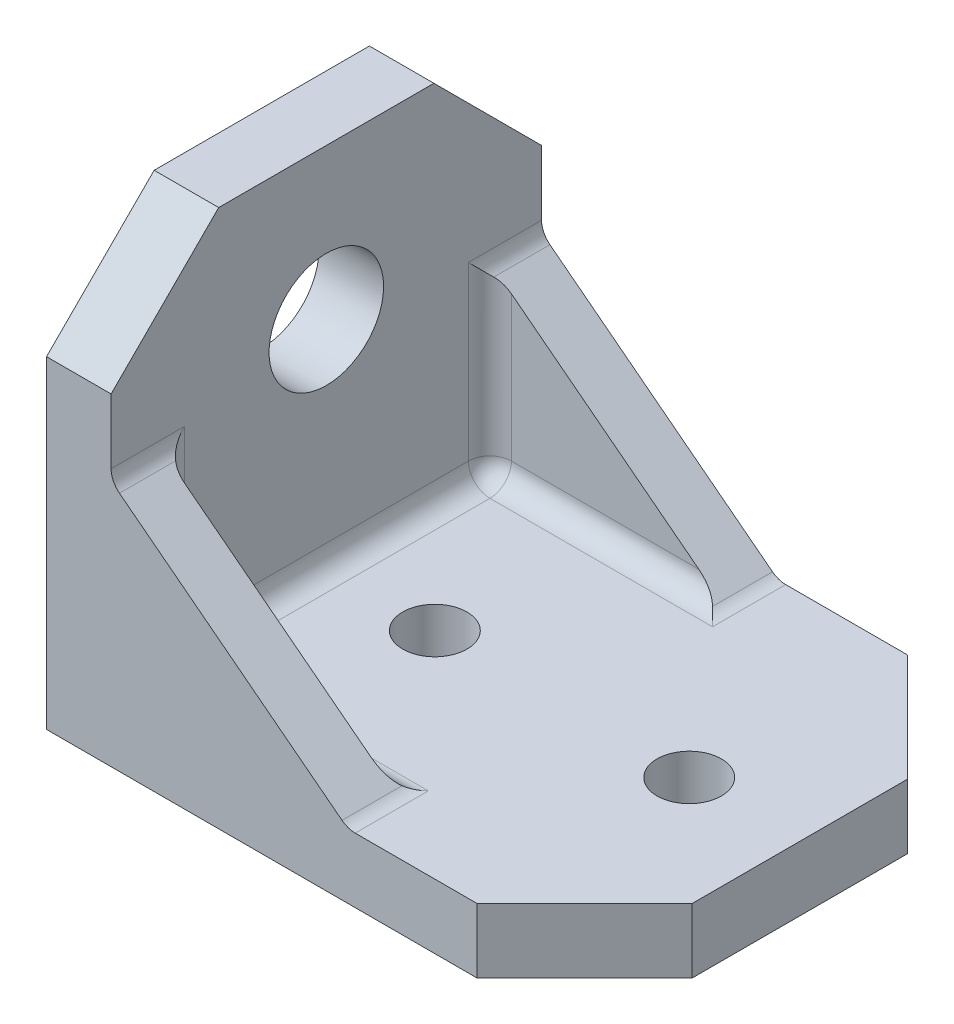
ISO-10303-21;
HEADER;
FILE_DESCRIPTION(('STEP AP214'),'2;1');
FILE_NAME('part.step','',(''),(''),'','','');
FILE_SCHEMA(('AUTOMOTIVE_DESIGN { 1 0 10303 214 1 1 1 1 }'));
ENDSEC;
DATA;
#1=APPLICATION_CONTEXT('core data for automotive mechanical design processes');
#2=APPLICATION_PROTOCOL_DEFINITION('international standard','automotive_design',2000,#1);
#3=PRODUCT_CONTEXT('',#1,'mechanical');
#4=PRODUCT('Part','Part','',(#3));
#5=PRODUCT_RELATED_PRODUCT_CATEGORY('part','',(#4));
#6=PRODUCT_DEFINITION_FORMATION('','',#4);
#7=PRODUCT_DEFINITION_CONTEXT('part definition',#1,'design');
#8=PRODUCT_DEFINITION('design','',#6,#7);
#9=PRODUCT_DEFINITION_SHAPE('','',#8);
#10=(LENGTH_UNIT() NAMED_UNIT(*) SI_UNIT(.MILLI.,.METRE.));
#11=(NAMED_UNIT(*) PLANE_ANGLE_UNIT() SI_UNIT($,.RADIAN.));
#12=(NAMED_UNIT(*) SI_UNIT($,.STERADIAN.) SOLID_ANGLE_UNIT());
#13=UNCERTAINTY_MEASURE_WITH_UNIT(LENGTH_MEASURE(1.E-05),#10,'distance_accuracy_value','');
#14=(GEOMETRIC_REPRESENTATION_CONTEXT(3) GLOBAL_UNCERTAINTY_ASSIGNED_CONTEXT((#13)) GLOBAL_UNIT_ASSIGNED_CONTEXT((#10,
#11,#12)) REPRESENTATION_CONTEXT('',''));
#15=CARTESIAN_POINT('',(0.,0.,0.));
#16=DIRECTION('',(0.,0.,1.));
#17=DIRECTION('',(1.,0.,0.));
#18=AXIS2_PLACEMENT_3D('',#15,#16,#17);
#19=CARTESIAN_POINT('',(0.,0.,25.4));
#20=DIRECTION('',(0.,1.,0.));
#21=DIRECTION('',(0.,0.,1.));
#22=AXIS2_PLACEMENT_3D('',#19,#20,#21);
#23=PLANE('',#22);
#24=CARTESIAN_POINT('',(10.2108,0.,12.7));
#25=DIRECTION('',(0.,1.,0.));
#26=DIRECTION('',(0.,0.,1.));
#27=AXIS2_PLACEMENT_3D('',#24,#25,#26);
#28=CIRCLE('',#27,1.89865);
#29=CARTESIAN_POINT('',(10.2108,0.,14.59865));
#30=VERTEX_POINT('',#29);
#31=EDGE_CURVE('E396',#30,#30,#28,.T.);
#32=ORIENTED_EDGE('',*,*,#31,.T.);
#33=EDGE_LOOP('',(#32));
#34=FACE_BOUND('',#33,.T.);
#35=CARTESIAN_POINT('',(25.2222,0.,12.7));
#36=DIRECTION('',(0.,1.,0.));
#37=DIRECTION('',(0.,0.,1.));
#38=AXIS2_PLACEMENT_3D('',#35,#36,#37);
#39=CIRCLE('',#38,1.89865);
#40=CARTESIAN_POINT('',(25.2222,0.,14.59865));
#41=VERTEX_POINT('',#40);
#42=EDGE_CURVE('E213',#41,#41,#39,.T.);
#43=ORIENTED_EDGE('',*,*,#42,.T.);
#44=EDGE_LOOP('',(#43));
#45=FACE_BOUND('',#44,.T.);
#46=DIRECTION('',(0.,0.,-1.));
#47=VECTOR('',#46,1.);
#48=CARTESIAN_POINT('',(31.75,0.,25.4));
#49=LINE('',#48,#47);
#50=CARTESIAN_POINT('',(31.75,0.,19.05));
#51=VERTEX_POINT('',#50);
#52=CARTESIAN_POINT('',(31.75,0.,6.35));
#53=VERTEX_POINT('',#52);
#54=EDGE_CURVE('E231',#51,#53,#49,.T.);
#55=ORIENTED_EDGE('',*,*,#54,.F.);
#56=DIRECTION('',(0.707106781186546,0.,-0.707106781186549));
#57=VECTOR('',#56,1.);
#58=CARTESIAN_POINT('',(25.4,0.,25.4));
#59=LINE('',#58,#57);
#60=CARTESIAN_POINT('',(25.4,0.,25.4));
#61=VERTEX_POINT('',#60);
#62=EDGE_CURVE('E11',#51,#61,#59,.F.);
#63=ORIENTED_EDGE('',*,*,#62,.T.);
#64=DIRECTION('',(1.,0.,0.));
#65=VECTOR('',#64,1.);
#66=CARTESIAN_POINT('',(0.,0.,25.4));
#67=LINE('',#66,#65);
#68=CARTESIAN_POINT('',(0.,0.,25.4));
#69=VERTEX_POINT('',#68);
#70=EDGE_CURVE('E191',#69,#61,#67,.T.);
#71=ORIENTED_EDGE('',*,*,#70,.F.);
#72=DIRECTION('',(0.,0.,-1.));
#73=VECTOR('',#72,1.);
#74=CARTESIAN_POINT('',(0.,0.,25.4));
#75=LINE('',#74,#73);
#76=CARTESIAN_POINT('',(0.,0.,0.));
#77=VERTEX_POINT('',#76);
#78=EDGE_CURVE('E196',#69,#77,#75,.T.);
#79=ORIENTED_EDGE('',*,*,#78,.T.);
#80=DIRECTION('',(1.,0.,0.));
#81=VECTOR('',#80,1.);
#82=CARTESIAN_POINT('',(0.,0.,0.));
#83=LINE('',#82,#81);
#84=CARTESIAN_POINT('',(25.4,0.,0.));
#85=VERTEX_POINT('',#84);
#86=EDGE_CURVE('E217',#77,#85,#83,.T.);
#87=ORIENTED_EDGE('',*,*,#86,.T.);
#88=DIRECTION('',(0.707106781186549,0.,0.707106781186546));
#89=VECTOR('',#88,1.);
#90=CARTESIAN_POINT('',(31.75,0.,6.35));
#91=LINE('',#90,#89);
#92=EDGE_CURVE('E43',#85,#53,#91,.T.);
#93=ORIENTED_EDGE('',*,*,#92,.T.);
#94=EDGE_LOOP('',(#55,#63,#71,#79,#87,#93));
#95=FACE_BOUND('',#94,.T.);
#96=ADVANCED_FACE('F35',(#34,#45,#95),#23,.F.);
#97=CARTESIAN_POINT('',(31.75,3.81,25.4));
#98=DIRECTION('',(-1.,0.,0.));
#99=DIRECTION('',(0.,0.,1.));
#100=AXIS2_PLACEMENT_3D('',#97,#98,#99);
#101=PLANE('',#100);
#102=DIRECTION('',(0.,0.,-1.));
#103=VECTOR('',#102,1.);
#104=CARTESIAN_POINT('',(31.75,3.81,25.4));
#105=LINE('',#104,#103);
#106=CARTESIAN_POINT('',(31.75,3.81,19.05));
#107=VERTEX_POINT('',#106);
#108=CARTESIAN_POINT('',(31.75,3.81,6.35));
#109=VERTEX_POINT('',#108);
#110=EDGE_CURVE('E228',#107,#109,#105,.T.);
#111=ORIENTED_EDGE('',*,*,#110,.F.);
#112=DIRECTION('',(0.,-1.,0.));
#113=VECTOR('',#112,1.);
#114=CARTESIAN_POINT('',(31.75,3.81,19.05));
#115=LINE('',#114,#113);
#116=EDGE_CURVE('E56',#107,#51,#115,.T.);
#117=ORIENTED_EDGE('',*,*,#116,.T.);
#118=ORIENTED_EDGE('',*,*,#54,.T.);
#119=DIRECTION('',(0.,1.,0.));
#120=VECTOR('',#119,1.);
#121=CARTESIAN_POINT('',(31.75,3.81,6.35));
#122=LINE('',#121,#120);
#123=EDGE_CURVE('E344',#53,#109,#122,.T.);
#124=ORIENTED_EDGE('',*,*,#123,.T.);
#125=EDGE_LOOP('',(#111,#117,#118,#124));
#126=FACE_BOUND('',#125,.T.);
#127=ADVANCED_FACE('F348',(#126),#101,.F.);
#128=CARTESIAN_POINT('',(3.81,3.81,25.4));
#129=DIRECTION('',(0.,-1.,0.));
#130=DIRECTION('',(0.,0.,-1.));
#131=AXIS2_PLACEMENT_3D('',#128,#129,#130);
#132=PLANE('',#131);
#133=CARTESIAN_POINT('',(10.2108,3.81,12.7));
#134=DIRECTION('',(0.,1.,0.));
#135=DIRECTION('',(0.,0.,1.));
#136=AXIS2_PLACEMENT_3D('',#133,#134,#135);
#137=CIRCLE('',#136,1.89865);
#138=CARTESIAN_POINT('',(10.2108,3.81,14.59865));
#139=VERTEX_POINT('',#138);
#140=EDGE_CURVE('E393',#139,#139,#137,.T.);
#141=ORIENTED_EDGE('',*,*,#140,.F.);
#142=EDGE_LOOP('',(#141));
#143=FACE_BOUND('',#142,.T.);
#144=CARTESIAN_POINT('',(25.2222,3.81,12.7));
#145=DIRECTION('',(0.,1.,0.));
#146=DIRECTION('',(0.,0.,1.));
#147=AXIS2_PLACEMENT_3D('',#144,#145,#146);
#148=CIRCLE('',#147,1.89865);
#149=CARTESIAN_POINT('',(25.2222,3.81,14.59865));
#150=VERTEX_POINT('',#149);
#151=EDGE_CURVE('E398',#150,#150,#148,.T.);
#152=ORIENTED_EDGE('',*,*,#151,.F.);
#153=EDGE_LOOP('',(#152));
#154=FACE_BOUND('',#153,.T.);
#155=DIRECTION('',(-1.,0.,0.));
#156=VECTOR('',#155,1.);
#157=CARTESIAN_POINT('',(3.81,3.81,25.4));
#158=LINE('',#157,#156);
#159=CARTESIAN_POINT('',(25.4,3.81,25.4));
#160=VERTEX_POINT('',#159);
#161=CARTESIAN_POINT('',(18.2135090874778,3.81,25.4));
#162=VERTEX_POINT('',#161);
#163=EDGE_CURVE('E207',#160,#162,#158,.T.);
#164=ORIENTED_EDGE('',*,*,#163,.F.);
#165=DIRECTION('',(-0.707106781186546,0.,0.707106781186549));
#166=VECTOR('',#165,1.);
#167=CARTESIAN_POINT('',(25.4,3.81,25.4));
#168=LINE('',#167,#166);
#169=EDGE_CURVE('E342',#160,#107,#168,.F.);
#170=ORIENTED_EDGE('',*,*,#169,.T.);
#171=ORIENTED_EDGE('',*,*,#110,.T.);
#172=DIRECTION('',(-0.707106781186549,0.,-0.707106781186546));
#173=VECTOR('',#172,1.);
#174=CARTESIAN_POINT('',(31.75,3.81,6.35));
#175=LINE('',#174,#173);
#176=CARTESIAN_POINT('',(25.4,3.81,0.));
#177=VERTEX_POINT('',#176);
#178=EDGE_CURVE('E340',#109,#177,#175,.T.);
#179=ORIENTED_EDGE('',*,*,#178,.T.);
#180=DIRECTION('',(-1.,0.,0.));
#181=VECTOR('',#180,1.);
#182=CARTESIAN_POINT('',(3.81,3.81,0.));
#183=LINE('',#182,#181);
#184=CARTESIAN_POINT('',(18.2135090874778,3.81,0.));
#185=VERTEX_POINT('',#184);
#186=EDGE_CURVE('E219',#177,#185,#183,.T.);
#187=ORIENTED_EDGE('',*,*,#186,.T.);
#188=DIRECTION('',(0.,0.,-1.));
#189=VECTOR('',#188,1.);
#190=CARTESIAN_POINT('',(18.2135090874778,3.81,25.4));
#191=LINE('',#190,#189);
#192=CARTESIAN_POINT('',(18.2135090874778,3.81,4.318));
#193=VERTEX_POINT('',#192);
#194=EDGE_CURVE('E239',#185,#193,#191,.F.);
#195=ORIENTED_EDGE('',*,*,#194,.T.);
#196=DIRECTION('',(-1.,0.,0.));
#197=VECTOR('',#196,1.);
#198=CARTESIAN_POINT('',(3.81,3.81,4.318));
#199=LINE('',#198,#197);
#200=CARTESIAN_POINT('',(5.08,3.81,4.318));
#201=VERTEX_POINT('',#200);
#202=EDGE_CURVE('E235',#193,#201,#199,.T.);
#203=ORIENTED_EDGE('',*,*,#202,.T.);
#204=DIRECTION('',(0.,0.,-1.));
#205=VECTOR('',#204,1.);
#206=CARTESIAN_POINT('',(5.08,3.81,22.352));
#207=LINE('',#206,#205);
#208=CARTESIAN_POINT('',(5.08,3.81,21.082));
#209=VERTEX_POINT('',#208);
#210=EDGE_CURVE('E233',#201,#209,#207,.F.);
#211=ORIENTED_EDGE('',*,*,#210,.T.);
#212=DIRECTION('',(1.,0.,0.));
#213=VECTOR('',#212,1.);
#214=CARTESIAN_POINT('',(17.78,3.81,21.082));
#215=LINE('',#214,#213);
#216=CARTESIAN_POINT('',(18.2135090874778,3.81,21.082));
#217=VERTEX_POINT('',#216);
#218=EDGE_CURVE('E237',#209,#217,#215,.T.);
#219=ORIENTED_EDGE('',*,*,#218,.T.);
#220=DIRECTION('',(0.,0.,1.));
#221=VECTOR('',#220,1.);
#222=CARTESIAN_POINT('',(18.2135090874778,3.81,25.4));
#223=LINE('',#222,#221);
#224=EDGE_CURVE('E241',#217,#162,#223,.T.);
#225=ORIENTED_EDGE('',*,*,#224,.T.);
#226=EDGE_LOOP('',(#164,#170,#171,#179,#187,#195,#203,#211,#219,#225));
#227=FACE_BOUND('',#226,.T.);
#228=ADVANCED_FACE('F352',(#143,#154,#227),#132,.F.);
#229=CARTESIAN_POINT('',(3.81,3.81,25.4));
#230=DIRECTION('',(-1.,0.,0.));
#231=DIRECTION('',(0.,0.,1.));
#232=AXIS2_PLACEMENT_3D('',#229,#230,#231);
#233=PLANE('',#232);
#234=DIRECTION('',(0.,0.,-1.));
#235=VECTOR('',#234,1.);
#236=CARTESIAN_POINT('',(3.81,25.4,25.4));
#237=LINE('',#236,#235);
#238=CARTESIAN_POINT('',(3.81,25.4,19.05));
#239=VERTEX_POINT('',#238);
#240=CARTESIAN_POINT('',(3.81,25.4,6.35));
#241=VERTEX_POINT('',#240);
#242=EDGE_CURVE('E225',#239,#241,#237,.T.);
#243=ORIENTED_EDGE('',*,*,#242,.F.);
#244=DIRECTION('',(0.,0.707106781186546,-0.707106781186549));
#245=VECTOR('',#244,1.);
#246=CARTESIAN_POINT('',(3.81,19.05,25.4));
#247=LINE('',#246,#245);
#248=CARTESIAN_POINT('',(3.81,19.05,25.4));
#249=VERTEX_POINT('',#248);
#250=EDGE_CURVE('E334',#239,#249,#247,.F.);
#251=ORIENTED_EDGE('',*,*,#250,.T.);
#252=DIRECTION('',(0.,1.,0.));
#253=VECTOR('',#252,1.);
#254=CARTESIAN_POINT('',(3.81,3.81,25.4));
#255=LINE('',#254,#253);
#256=CARTESIAN_POINT('',(3.81,15.2286206585056,25.4));
#257=VERTEX_POINT('',#256);
#258=EDGE_CURVE('E197',#257,#249,#255,.T.);
#259=ORIENTED_EDGE('',*,*,#258,.F.);
#260=DIRECTION('',(0.,0.,1.));
#261=VECTOR('',#260,1.);
#262=CARTESIAN_POINT('',(3.81,15.2286206585056,25.4));
#263=LINE('',#262,#261);
#264=CARTESIAN_POINT('',(3.81,15.2286206585056,21.082));
#265=VERTEX_POINT('',#264);
#266=EDGE_CURVE('E256',#257,#265,#263,.F.);
#267=ORIENTED_EDGE('',*,*,#266,.T.);
#268=DIRECTION('',(0.,-1.,0.));
#269=VECTOR('',#268,1.);
#270=CARTESIAN_POINT('',(3.81,3.81,21.082));
#271=LINE('',#270,#269);
#272=CARTESIAN_POINT('',(3.81,5.08,21.082));
#273=VERTEX_POINT('',#272);
#274=EDGE_CURVE('E252',#265,#273,#271,.T.);
#275=ORIENTED_EDGE('',*,*,#274,.T.);
#276=DIRECTION('',(0.,0.,-1.));
#277=VECTOR('',#276,1.);
#278=CARTESIAN_POINT('',(3.81,5.08,3.048));
#279=LINE('',#278,#277);
#280=CARTESIAN_POINT('',(3.81,5.08,4.318));
#281=VERTEX_POINT('',#280);
#282=EDGE_CURVE('E248',#273,#281,#279,.T.);
#283=ORIENTED_EDGE('',*,*,#282,.T.);
#284=DIRECTION('',(0.,1.,0.));
#285=VECTOR('',#284,1.);
#286=CARTESIAN_POINT('',(3.81,3.81,4.318));
#287=LINE('',#286,#285);
#288=CARTESIAN_POINT('',(3.81,15.2286206585056,4.318));
#289=VERTEX_POINT('',#288);
#290=EDGE_CURVE('E250',#281,#289,#287,.T.);
#291=ORIENTED_EDGE('',*,*,#290,.T.);
#292=DIRECTION('',(0.,0.,-1.));
#293=VECTOR('',#292,1.);
#294=CARTESIAN_POINT('',(3.81,15.2286206585056,25.4));
#295=LINE('',#294,#293);
#296=CARTESIAN_POINT('',(3.81,15.2286206585056,0.));
#297=VERTEX_POINT('',#296);
#298=EDGE_CURVE('E254',#289,#297,#295,.T.);
#299=ORIENTED_EDGE('',*,*,#298,.T.);
#300=DIRECTION('',(0.,1.,0.));
#301=VECTOR('',#300,1.);
#302=CARTESIAN_POINT('',(3.81,3.81,0.));
#303=LINE('',#302,#301);
#304=CARTESIAN_POINT('',(3.81,19.05,0.));
#305=VERTEX_POINT('',#304);
#306=EDGE_CURVE('E210',#297,#305,#303,.T.);
#307=ORIENTED_EDGE('',*,*,#306,.T.);
#308=DIRECTION('',(0.,0.707106781186549,0.707106781186546));
#309=VECTOR('',#308,1.);
#310=CARTESIAN_POINT('',(3.81,25.4,6.35));
#311=LINE('',#310,#309);
#312=EDGE_CURVE('E332',#305,#241,#311,.T.);
#313=ORIENTED_EDGE('',*,*,#312,.T.);
#314=EDGE_LOOP('',(#243,#251,#259,#267,#275,#283,#291,#299,#307,#313));
#315=FACE_BOUND('',#314,.T.);
#316=CARTESIAN_POINT('',(3.81,16.51,12.7));
#317=DIRECTION('',(1.,0.,0.));
#318=DIRECTION('',(0.,0.,-1.));
#319=AXIS2_PLACEMENT_3D('',#316,#317,#318);
#320=CIRCLE('',#319,3.3782);
#321=CARTESIAN_POINT('',(3.81,16.51,9.3218));
#322=VERTEX_POINT('',#321);
#323=EDGE_CURVE('E380',#322,#322,#320,.T.);
#324=ORIENTED_EDGE('',*,*,#323,.F.);
#325=EDGE_LOOP('',(#324));
#326=FACE_BOUND('',#325,.T.);
#327=ADVANCED_FACE('F505',(#315,#326),#233,.F.);
#328=CARTESIAN_POINT('',(0.,25.4,25.4));
#329=DIRECTION('',(0.,-1.,0.));
#330=DIRECTION('',(0.,0.,-1.));
#331=AXIS2_PLACEMENT_3D('',#328,#329,#330);
#332=PLANE('',#331);
#333=DIRECTION('',(0.,0.,-1.));
#334=VECTOR('',#333,1.);
#335=CARTESIAN_POINT('',(0.,25.4,25.4));
#336=LINE('',#335,#334);
#337=CARTESIAN_POINT('',(0.,25.4,19.05));
#338=VERTEX_POINT('',#337);
#339=CARTESIAN_POINT('',(0.,25.4,6.35));
#340=VERTEX_POINT('',#339);
#341=EDGE_CURVE('E204',#338,#340,#336,.T.);
#342=ORIENTED_EDGE('',*,*,#341,.F.);
#343=DIRECTION('',(1.,0.,0.));
#344=VECTOR('',#343,1.);
#345=CARTESIAN_POINT('',(0.,25.4,19.05));
#346=LINE('',#345,#344);
#347=EDGE_CURVE('E330',#338,#239,#346,.T.);
#348=ORIENTED_EDGE('',*,*,#347,.T.);
#349=ORIENTED_EDGE('',*,*,#242,.T.);
#350=DIRECTION('',(-1.,0.,0.));
#351=VECTOR('',#350,1.);
#352=CARTESIAN_POINT('',(0.,25.4,6.35));
#353=LINE('',#352,#351);
#354=EDGE_CURVE('E327',#241,#340,#353,.T.);
#355=ORIENTED_EDGE('',*,*,#354,.T.);
#356=EDGE_LOOP('',(#342,#348,#349,#355));
#357=FACE_BOUND('',#356,.T.);
#358=ADVANCED_FACE('F511',(#357),#332,.F.);
#359=CARTESIAN_POINT('',(0.,0.,25.4));
#360=DIRECTION('',(1.,0.,0.));
#361=DIRECTION('',(0.,0.,-1.));
#362=AXIS2_PLACEMENT_3D('',#359,#360,#361);
#363=PLANE('',#362);
#364=CARTESIAN_POINT('',(0.,16.51,12.7));
#365=DIRECTION('',(1.,0.,0.));
#366=DIRECTION('',(0.,0.,-1.));
#367=AXIS2_PLACEMENT_3D('',#364,#365,#366);
#368=CIRCLE('',#367,3.3782);
#369=CARTESIAN_POINT('',(0.,16.51,9.3218));
#370=VERTEX_POINT('',#369);
#371=EDGE_CURVE('E384',#370,#370,#368,.T.);
#372=ORIENTED_EDGE('',*,*,#371,.T.);
#373=EDGE_LOOP('',(#372));
#374=FACE_BOUND('',#373,.T.);
#375=DIRECTION('',(0.,-1.,0.));
#376=VECTOR('',#375,1.);
#377=CARTESIAN_POINT('',(0.,0.,25.4));
#378=LINE('',#377,#376);
#379=CARTESIAN_POINT('',(0.,19.05,25.4));
#380=VERTEX_POINT('',#379);
#381=EDGE_CURVE('E185',#380,#69,#378,.T.);
#382=ORIENTED_EDGE('',*,*,#381,.F.);
#383=DIRECTION('',(0.,-0.707106781186546,0.707106781186549));
#384=VECTOR('',#383,1.);
#385=CARTESIAN_POINT('',(0.,19.05,25.4));
#386=LINE('',#385,#384);
#387=EDGE_CURVE('E325',#380,#338,#386,.F.);
#388=ORIENTED_EDGE('',*,*,#387,.T.);
#389=ORIENTED_EDGE('',*,*,#341,.T.);
#390=DIRECTION('',(0.,-0.707106781186549,-0.707106781186546));
#391=VECTOR('',#390,1.);
#392=CARTESIAN_POINT('',(0.,25.4,6.35));
#393=LINE('',#392,#391);
#394=CARTESIAN_POINT('',(0.,19.05,0.));
#395=VERTEX_POINT('',#394);
#396=EDGE_CURVE('E323',#340,#395,#393,.T.);
#397=ORIENTED_EDGE('',*,*,#396,.T.);
#398=DIRECTION('',(0.,-1.,0.));
#399=VECTOR('',#398,1.);
#400=CARTESIAN_POINT('',(0.,0.,0.));
#401=LINE('',#400,#399);
#402=EDGE_CURVE('E202',#395,#77,#401,.T.);
#403=ORIENTED_EDGE('',*,*,#402,.T.);
#404=ORIENTED_EDGE('',*,*,#78,.F.);
#405=EDGE_LOOP('',(#382,#388,#389,#397,#403,#404));
#406=FACE_BOUND('',#405,.T.);
#407=ADVANCED_FACE('F200',(#374,#406),#363,.F.);
#408=CARTESIAN_POINT('',(0.,0.,25.4));
#409=DIRECTION('',(0.,0.,-1.));
#410=DIRECTION('',(-1.,0.,0.));
#411=AXIS2_PLACEMENT_3D('',#408,#409,#410);
#412=PLANE('',#411);
#413=ORIENTED_EDGE('',*,*,#258,.T.);
#414=DIRECTION('',(-1.,0.,0.));
#415=VECTOR('',#414,1.);
#416=CARTESIAN_POINT('',(0.,19.05,25.4));
#417=LINE('',#416,#415);
#418=EDGE_CURVE('E194',#249,#380,#417,.T.);
#419=ORIENTED_EDGE('',*,*,#418,.T.);
#420=ORIENTED_EDGE('',*,*,#381,.T.);
#421=ORIENTED_EDGE('',*,*,#70,.T.);
#422=DIRECTION('',(0.,1.,0.));
#423=VECTOR('',#422,1.);
#424=CARTESIAN_POINT('',(25.4,0.,25.4));
#425=LINE('',#424,#423);
#426=EDGE_CURVE('E289',#61,#160,#425,.T.);
#427=ORIENTED_EDGE('',*,*,#426,.T.);
#428=ORIENTED_EDGE('',*,*,#163,.T.);
#429=CARTESIAN_POINT('',(18.2135090874778,5.08,25.4));
#430=DIRECTION('',(0.,0.,-1.));
#431=DIRECTION('',(-1.,0.,0.));
#432=AXIS2_PLACEMENT_3D('',#429,#430,#431);
#433=CIRCLE('',#432,1.27);
#434=CARTESIAN_POINT('',(17.4369707611116,4.07506804823195,25.4));
#435=VERTEX_POINT('',#434);
#436=EDGE_CURVE('E270',#162,#435,#433,.T.);
#437=ORIENTED_EDGE('',*,*,#436,.T.);
#438=DIRECTION('',(-0.791285001392167,0.611447501075766,0.));
#439=VECTOR('',#438,1.);
#440=CARTESIAN_POINT('',(17.78,3.81,25.4));
#441=LINE('',#440,#439);
#442=CARTESIAN_POINT('',(4.30346167363377,14.2236887067375,25.4));
#443=VERTEX_POINT('',#442);
#444=EDGE_CURVE('E381',#435,#443,#441,.T.);
#445=ORIENTED_EDGE('',*,*,#444,.T.);
#446=CARTESIAN_POINT('',(5.08,15.2286206585056,25.4));
#447=DIRECTION('',(0.,0.,-1.));
#448=DIRECTION('',(-1.,0.,0.));
#449=AXIS2_PLACEMENT_3D('',#446,#447,#448);
#450=CIRCLE('',#449,1.27);
#451=EDGE_CURVE('E272',#443,#257,#450,.T.);
#452=ORIENTED_EDGE('',*,*,#451,.T.);
#453=EDGE_LOOP('',(#413,#419,#420,#421,#427,#428,#437,#445,#452));
#454=FACE_BOUND('',#453,.T.);
#455=ADVANCED_FACE('F188',(#454),#412,.F.);
#456=CARTESIAN_POINT('',(0.,0.,0.));
#457=DIRECTION('',(0.,0.,-1.));
#458=DIRECTION('',(-1.,0.,0.));
#459=AXIS2_PLACEMENT_3D('',#456,#457,#458);
#460=PLANE('',#459);
#461=ORIENTED_EDGE('',*,*,#402,.F.);
#462=DIRECTION('',(1.,0.,0.));
#463=VECTOR('',#462,1.);
#464=CARTESIAN_POINT('',(3.81,19.05,0.));
#465=LINE('',#464,#463);
#466=EDGE_CURVE('E338',#395,#305,#465,.T.);
#467=ORIENTED_EDGE('',*,*,#466,.T.);
#468=ORIENTED_EDGE('',*,*,#306,.F.);
#469=CARTESIAN_POINT('',(5.08,15.2286206585056,0.));
#470=DIRECTION('',(0.,0.,-1.));
#471=DIRECTION('',(-1.,0.,0.));
#472=AXIS2_PLACEMENT_3D('',#469,#470,#471);
#473=CIRCLE('',#472,1.27);
#474=CARTESIAN_POINT('',(4.30346167363378,14.2236887067375,0.));
#475=VERTEX_POINT('',#474);
#476=EDGE_CURVE('E274',#297,#475,#473,.F.);
#477=ORIENTED_EDGE('',*,*,#476,.T.);
#478=DIRECTION('',(0.791285001392167,-0.611447501075765,0.));
#479=VECTOR('',#478,1.);
#480=CARTESIAN_POINT('',(17.78,3.81,0.));
#481=LINE('',#480,#479);
#482=CARTESIAN_POINT('',(17.4369707611116,4.07506804823195,0.));
#483=VERTEX_POINT('',#482);
#484=EDGE_CURVE('E320',#475,#483,#481,.T.);
#485=ORIENTED_EDGE('',*,*,#484,.T.);
#486=CARTESIAN_POINT('',(18.2135090874778,5.08,0.));
#487=DIRECTION('',(0.,0.,-1.));
#488=DIRECTION('',(-1.,0.,0.));
#489=AXIS2_PLACEMENT_3D('',#486,#487,#488);
#490=CIRCLE('',#489,1.27);
#491=EDGE_CURVE('E276',#483,#185,#490,.F.);
#492=ORIENTED_EDGE('',*,*,#491,.T.);
#493=ORIENTED_EDGE('',*,*,#186,.F.);
#494=DIRECTION('',(0.,-1.,0.));
#495=VECTOR('',#494,1.);
#496=CARTESIAN_POINT('',(25.4,0.,0.));
#497=LINE('',#496,#495);
#498=EDGE_CURVE('E336',#177,#85,#497,.T.);
#499=ORIENTED_EDGE('',*,*,#498,.T.);
#500=ORIENTED_EDGE('',*,*,#86,.F.);
#501=EDGE_LOOP('',(#461,#467,#468,#477,#485,#492,#493,#499,#500));
#502=FACE_BOUND('',#501,.T.);
#503=ADVANCED_FACE('F409',(#502),#460,.T.);
#504=CARTESIAN_POINT('',(25.2222,3.81,12.7));
#505=DIRECTION('',(0.,1.,0.));
#506=DIRECTION('',(0.,0.,1.));
#507=AXIS2_PLACEMENT_3D('',#504,#505,#506);
#508=CYLINDRICAL_SURFACE('',#507,1.89865);
#509=ORIENTED_EDGE('',*,*,#42,.F.);
#510=EDGE_LOOP('',(#509));
#511=FACE_BOUND('',#510,.T.);
#512=ORIENTED_EDGE('',*,*,#151,.T.);
#513=EDGE_LOOP('',(#512));
#514=FACE_BOUND('',#513,.T.);
#515=ADVANCED_FACE('F406',(#511,#514),#508,.F.);
#516=CARTESIAN_POINT('',(10.2108,3.81,12.7));
#517=DIRECTION('',(0.,1.,0.));
#518=DIRECTION('',(0.,0.,1.));
#519=AXIS2_PLACEMENT_3D('',#516,#517,#518);
#520=CYLINDRICAL_SURFACE('',#519,1.89865);
#521=ORIENTED_EDGE('',*,*,#31,.F.);
#522=EDGE_LOOP('',(#521));
#523=FACE_BOUND('',#522,.T.);
#524=ORIENTED_EDGE('',*,*,#140,.T.);
#525=EDGE_LOOP('',(#524));
#526=FACE_BOUND('',#525,.T.);
#527=ADVANCED_FACE('F408',(#523,#526),#520,.F.);
#528=CARTESIAN_POINT('',(3.81,16.51,12.7));
#529=DIRECTION('',(1.,0.,0.));
#530=DIRECTION('',(0.,0.,-1.));
#531=AXIS2_PLACEMENT_3D('',#528,#529,#530);
#532=CYLINDRICAL_SURFACE('',#531,3.3782);
#533=ORIENTED_EDGE('',*,*,#371,.F.);
#534=EDGE_LOOP('',(#533));
#535=FACE_BOUND('',#534,.T.);
#536=ORIENTED_EDGE('',*,*,#323,.T.);
#537=EDGE_LOOP('',(#536));
#538=FACE_BOUND('',#537,.T.);
#539=ADVANCED_FACE('F415',(#535,#538),#532,.F.);
#540=CARTESIAN_POINT('',(17.78,3.81,22.352));
#541=DIRECTION('',(0.611447501075766,0.791285001392167,0.));
#542=DIRECTION('',(-0.791285001392167,0.611447501075766,0.));
#543=AXIS2_PLACEMENT_3D('',#540,#541,#542);
#544=PLANE('',#543);
#545=ORIENTED_EDGE('',*,*,#444,.F.);
#546=DIRECTION('',(0.,0.,1.));
#547=VECTOR('',#546,1.);
#548=CARTESIAN_POINT('',(17.4369707611116,4.07506804823195,22.352));
#549=LINE('',#548,#547);
#550=CARTESIAN_POINT('',(17.4369707611116,4.07506804823195,21.8585383263663));
#551=VERTEX_POINT('',#550);
#552=EDGE_CURVE('E246',#435,#551,#549,.F.);
#553=ORIENTED_EDGE('',*,*,#552,.T.);
#554=CARTESIAN_POINT('',(16.1364705882353,5.08,21.082));
#555=DIRECTION('',(0.611447501075766,0.791285001392167,0.));
#556=DIRECTION('',(-0.791285001392167,0.611447501075766,0.));
#557=AXIS2_PLACEMENT_3D('',#554,#555,#556);
#558=ELLIPSE('',#557,2.07703849924252,1.27);
#559=CARTESIAN_POINT('',(16.1364705882353,5.08,22.352));
#560=VERTEX_POINT('',#559);
#561=EDGE_CURVE('E279',#551,#560,#558,.F.);
#562=ORIENTED_EDGE('',*,*,#561,.T.);
#563=DIRECTION('',(-0.791285001392167,0.611447501075766,0.));
#564=VECTOR('',#563,1.);
#565=CARTESIAN_POINT('',(17.78,3.81,22.352));
#566=LINE('',#565,#564);
#567=CARTESIAN_POINT('',(5.08,13.6236363636364,22.352));
#568=VERTEX_POINT('',#567);
#569=EDGE_CURVE('E375',#560,#568,#566,.T.);
#570=ORIENTED_EDGE('',*,*,#569,.T.);
#571=CARTESIAN_POINT('',(5.08,13.6236363636364,21.082));
#572=DIRECTION('',(0.611447501075766,0.791285001392167,0.));
#573=DIRECTION('',(-0.791285001392167,0.611447501075766,0.));
#574=AXIS2_PLACEMENT_3D('',#571,#572,#573);
#575=ELLIPSE('',#574,1.60498429486922,1.27);
#576=CARTESIAN_POINT('',(4.30346167363378,14.2236887067375,22.0869319517681));
#577=VERTEX_POINT('',#576);
#578=EDGE_CURVE('E281',#568,#577,#575,.F.);
#579=ORIENTED_EDGE('',*,*,#578,.T.);
#580=DIRECTION('',(0.,0.,1.));
#581=VECTOR('',#580,1.);
#582=CARTESIAN_POINT('',(4.30346167363377,14.2236887067375,22.352));
#583=LINE('',#582,#581);
#584=EDGE_CURVE('E244',#577,#443,#583,.T.);
#585=ORIENTED_EDGE('',*,*,#584,.T.);
#586=EDGE_LOOP('',(#545,#553,#562,#570,#579,#585));
#587=FACE_BOUND('',#586,.T.);
#588=ADVANCED_FACE('F374',(#587),#544,.T.);
#589=CARTESIAN_POINT('',(0.,0.,22.352));
#590=DIRECTION('',(0.,0.,1.));
#591=DIRECTION('',(1.,0.,0.));
#592=AXIS2_PLACEMENT_3D('',#589,#590,#591);
#593=PLANE('',#592);
#594=ORIENTED_EDGE('',*,*,#569,.F.);
#595=DIRECTION('',(1.,0.,0.));
#596=VECTOR('',#595,1.);
#597=CARTESIAN_POINT('',(3.81,5.08,22.352));
#598=LINE('',#597,#596);
#599=CARTESIAN_POINT('',(5.08,5.08,22.352));
#600=VERTEX_POINT('',#599);
#601=EDGE_CURVE('E264',#560,#600,#598,.F.);
#602=ORIENTED_EDGE('',*,*,#601,.T.);
#603=DIRECTION('',(0.,-1.,0.));
#604=VECTOR('',#603,1.);
#605=CARTESIAN_POINT('',(5.08,14.605,22.352));
#606=LINE('',#605,#604);
#607=EDGE_CURVE('E262',#600,#568,#606,.F.);
#608=ORIENTED_EDGE('',*,*,#607,.T.);
#609=EDGE_LOOP('',(#594,#602,#608));
#610=FACE_BOUND('',#609,.T.);
#611=ADVANCED_FACE('F378',(#610),#593,.F.);
#612=CARTESIAN_POINT('',(17.78,3.81,3.048));
#613=DIRECTION('',(0.611447501075765,0.791285001392167,0.));
#614=DIRECTION('',(-0.791285001392167,0.611447501075765,0.));
#615=AXIS2_PLACEMENT_3D('',#612,#613,#614);
#616=PLANE('',#615);
#617=ORIENTED_EDGE('',*,*,#484,.F.);
#618=DIRECTION('',(0.,0.,-1.));
#619=VECTOR('',#618,1.);
#620=CARTESIAN_POINT('',(4.30346167363378,14.2236887067375,3.048));
#621=LINE('',#620,#619);
#622=CARTESIAN_POINT('',(4.30346167363378,14.2236887067375,3.31306804823195));
#623=VERTEX_POINT('',#622);
#624=EDGE_CURVE('E260',#475,#623,#621,.F.);
#625=ORIENTED_EDGE('',*,*,#624,.T.);
#626=CARTESIAN_POINT('',(5.08,13.6236363636364,4.318));
#627=DIRECTION('',(0.611447501075765,0.791285001392167,0.));
#628=DIRECTION('',(-0.791285001392167,0.611447501075765,0.));
#629=AXIS2_PLACEMENT_3D('',#626,#627,#628);
#630=ELLIPSE('',#629,1.60498429486922,1.27);
#631=CARTESIAN_POINT('',(5.08,13.6236363636364,3.048));
#632=VERTEX_POINT('',#631);
#633=EDGE_CURVE('E287',#623,#632,#630,.F.);
#634=ORIENTED_EDGE('',*,*,#633,.T.);
#635=DIRECTION('',(0.791285001392167,-0.611447501075765,0.));
#636=VECTOR('',#635,1.);
#637=CARTESIAN_POINT('',(17.78,3.81,3.048));
#638=LINE('',#637,#636);
#639=CARTESIAN_POINT('',(16.1364705882353,5.08,3.048));
#640=VERTEX_POINT('',#639);
#641=EDGE_CURVE('E386',#632,#640,#638,.T.);
#642=ORIENTED_EDGE('',*,*,#641,.T.);
#643=CARTESIAN_POINT('',(16.1364705882353,5.08,4.318));
#644=DIRECTION('',(0.611447501075765,0.791285001392167,0.));
#645=DIRECTION('',(-0.791285001392167,0.611447501075765,0.));
#646=AXIS2_PLACEMENT_3D('',#643,#644,#645);
#647=ELLIPSE('',#646,2.07703849924253,1.27);
#648=CARTESIAN_POINT('',(17.4369707611116,4.07506804823195,3.54146167363374));
#649=VERTEX_POINT('',#648);
#650=EDGE_CURVE('E284',#640,#649,#647,.F.);
#651=ORIENTED_EDGE('',*,*,#650,.T.);
#652=DIRECTION('',(0.,0.,-1.));
#653=VECTOR('',#652,1.);
#654=CARTESIAN_POINT('',(17.4369707611116,4.07506804823195,3.048));
#655=LINE('',#654,#653);
#656=EDGE_CURVE('E258',#649,#483,#655,.T.);
#657=ORIENTED_EDGE('',*,*,#656,.T.);
#658=EDGE_LOOP('',(#617,#625,#634,#642,#651,#657));
#659=FACE_BOUND('',#658,.T.);
#660=ADVANCED_FACE('F527',(#659),#616,.T.);
#661=CARTESIAN_POINT('',(0.,0.,3.048));
#662=DIRECTION('',(0.,0.,1.));
#663=DIRECTION('',(1.,0.,0.));
#664=AXIS2_PLACEMENT_3D('',#661,#662,#663);
#665=PLANE('',#664);
#666=DIRECTION('',(0.,1.,0.));
#667=VECTOR('',#666,1.);
#668=CARTESIAN_POINT('',(5.08,0.,3.048));
#669=LINE('',#668,#667);
#670=CARTESIAN_POINT('',(5.08,5.08,3.048));
#671=VERTEX_POINT('',#670);
#672=EDGE_CURVE('E266',#632,#671,#669,.F.);
#673=ORIENTED_EDGE('',*,*,#672,.T.);
#674=DIRECTION('',(-1.,0.,0.));
#675=VECTOR('',#674,1.);
#676=CARTESIAN_POINT('',(0.,5.08,3.048));
#677=LINE('',#676,#675);
#678=EDGE_CURVE('E268',#671,#640,#677,.F.);
#679=ORIENTED_EDGE('',*,*,#678,.T.);
#680=ORIENTED_EDGE('',*,*,#641,.F.);
#681=EDGE_LOOP('',(#673,#679,#680));
#682=FACE_BOUND('',#681,.T.);
#683=ADVANCED_FACE('F470',(#682),#665,.T.);
#684=CARTESIAN_POINT('',(5.08,15.2286206585056,25.4));
#685=DIRECTION('',(0.,0.,-1.));
#686=DIRECTION('',(-1.,0.,0.));
#687=AXIS2_PLACEMENT_3D('',#684,#685,#686);
#688=CYLINDRICAL_SURFACE('',#687,1.27);
#689=ORIENTED_EDGE('',*,*,#476,.F.);
#690=ORIENTED_EDGE('',*,*,#298,.F.);
#691=CARTESIAN_POINT('',(5.08,15.2286206585056,4.318));
#692=DIRECTION('',(0.,0.707106781186547,-0.707106781186547));
#693=DIRECTION('',(0.,0.707106781186547,0.707106781186547));
#694=AXIS2_PLACEMENT_3D('',#691,#692,#693);
#695=ELLIPSE('',#694,1.79605122421383,1.27);
#696=EDGE_CURVE('E317',#623,#289,#695,.T.);
#697=ORIENTED_EDGE('',*,*,#696,.F.);
#698=ORIENTED_EDGE('',*,*,#624,.F.);
#699=EDGE_LOOP('',(#689,#690,#697,#698));
#700=FACE_BOUND('',#699,.T.);
#701=ADVANCED_FACE('F466',(#700),#688,.F.);
#702=CARTESIAN_POINT('',(18.2135090874778,5.08,3.048));
#703=DIRECTION('',(0.,0.,-1.));
#704=DIRECTION('',(-1.,0.,0.));
#705=AXIS2_PLACEMENT_3D('',#702,#703,#704);
#706=CYLINDRICAL_SURFACE('',#705,1.27);
#707=ORIENTED_EDGE('',*,*,#656,.F.);
#708=CARTESIAN_POINT('',(18.2135090874778,5.08,4.318));
#709=DIRECTION('',(-0.707106781186547,0.,0.707106781186547));
#710=DIRECTION('',(-0.707106781186547,0.,-0.707106781186547));
#711=AXIS2_PLACEMENT_3D('',#708,#709,#710);
#712=ELLIPSE('',#711,1.79605122421383,1.27);
#713=EDGE_CURVE('E314',#193,#649,#712,.F.);
#714=ORIENTED_EDGE('',*,*,#713,.F.);
#715=ORIENTED_EDGE('',*,*,#194,.F.);
#716=ORIENTED_EDGE('',*,*,#491,.F.);
#717=EDGE_LOOP('',(#707,#714,#715,#716));
#718=FACE_BOUND('',#717,.T.);
#719=ADVANCED_FACE('F462',(#718),#706,.F.);
#720=CARTESIAN_POINT('',(5.08,3.81,4.318));
#721=DIRECTION('',(0.,1.,0.));
#722=DIRECTION('',(0.,0.,1.));
#723=AXIS2_PLACEMENT_3D('',#720,#721,#722);
#724=CYLINDRICAL_SURFACE('',#723,1.27);
#725=ORIENTED_EDGE('',*,*,#696,.T.);
#726=ORIENTED_EDGE('',*,*,#290,.F.);
#727=CARTESIAN_POINT('',(5.08,5.08,4.318));
#728=DIRECTION('',(0.,1.,0.));
#729=DIRECTION('',(0.,0.,1.));
#730=AXIS2_PLACEMENT_3D('',#727,#728,#729);
#731=CIRCLE('',#730,1.27);
#732=EDGE_CURVE('E311',#671,#281,#731,.T.);
#733=ORIENTED_EDGE('',*,*,#732,.F.);
#734=ORIENTED_EDGE('',*,*,#672,.F.);
#735=ORIENTED_EDGE('',*,*,#633,.F.);
#736=EDGE_LOOP('',(#725,#726,#733,#734,#735));
#737=FACE_BOUND('',#736,.T.);
#738=ADVANCED_FACE('F458',(#737),#724,.F.);
#739=CARTESIAN_POINT('',(3.81,5.08,4.318));
#740=DIRECTION('',(-1.,0.,0.));
#741=DIRECTION('',(0.,0.,1.));
#742=AXIS2_PLACEMENT_3D('',#739,#740,#741);
#743=CYLINDRICAL_SURFACE('',#742,1.27);
#744=ORIENTED_EDGE('',*,*,#650,.F.);
#745=ORIENTED_EDGE('',*,*,#678,.F.);
#746=CARTESIAN_POINT('',(5.08,5.08,4.318));
#747=DIRECTION('',(1.,0.,0.));
#748=DIRECTION('',(0.,0.,-1.));
#749=AXIS2_PLACEMENT_3D('',#746,#747,#748);
#750=CIRCLE('',#749,1.27);
#751=EDGE_CURVE('E308',#201,#671,#750,.T.);
#752=ORIENTED_EDGE('',*,*,#751,.F.);
#753=ORIENTED_EDGE('',*,*,#202,.F.);
#754=ORIENTED_EDGE('',*,*,#713,.T.);
#755=EDGE_LOOP('',(#744,#745,#752,#753,#754));
#756=FACE_BOUND('',#755,.T.);
#757=ADVANCED_FACE('F454',(#756),#743,.F.);
#758=CARTESIAN_POINT('',(5.08,15.2286206585056,22.352));
#759=DIRECTION('',(0.,0.,1.));
#760=DIRECTION('',(1.,0.,0.));
#761=AXIS2_PLACEMENT_3D('',#758,#759,#760);
#762=CYLINDRICAL_SURFACE('',#761,1.27);
#763=ORIENTED_EDGE('',*,*,#584,.F.);
#764=CARTESIAN_POINT('',(5.08,15.2286206585056,21.082));
#765=DIRECTION('',(0.,0.707106781186547,0.707106781186547));
#766=DIRECTION('',(0.,0.707106781186547,-0.707106781186547));
#767=AXIS2_PLACEMENT_3D('',#764,#765,#766);
#768=ELLIPSE('',#767,1.79605122421383,1.27);
#769=EDGE_CURVE('E305',#265,#577,#768,.T.);
#770=ORIENTED_EDGE('',*,*,#769,.F.);
#771=ORIENTED_EDGE('',*,*,#266,.F.);
#772=ORIENTED_EDGE('',*,*,#451,.F.);
#773=EDGE_LOOP('',(#763,#770,#771,#772));
#774=FACE_BOUND('',#773,.T.);
#775=ADVANCED_FACE('F450',(#774),#762,.F.);
#776=CARTESIAN_POINT('',(5.08,5.08,4.318));
#777=DIRECTION('',(0.,0.,1.));
#778=DIRECTION('',(1.,0.,0.));
#779=AXIS2_PLACEMENT_3D('',#776,#777,#778);
#780=SPHERICAL_SURFACE('',#779,1.27);
#781=ORIENTED_EDGE('',*,*,#751,.T.);
#782=ORIENTED_EDGE('',*,*,#732,.T.);
#783=CARTESIAN_POINT('',(5.08,5.08,4.318));
#784=DIRECTION('',(0.,0.,1.));
#785=DIRECTION('',(1.,0.,0.));
#786=AXIS2_PLACEMENT_3D('',#783,#784,#785);
#787=CIRCLE('',#786,1.27);
#788=EDGE_CURVE('E302',#201,#281,#787,.F.);
#789=ORIENTED_EDGE('',*,*,#788,.F.);
#790=EDGE_LOOP('',(#781,#782,#789));
#791=FACE_BOUND('',#790,.T.);
#792=ADVANCED_FACE('F446',(#791),#780,.F.);
#793=CARTESIAN_POINT('',(5.08,3.81,21.082));
#794=DIRECTION('',(0.,1.,0.));
#795=DIRECTION('',(0.,0.,1.));
#796=AXIS2_PLACEMENT_3D('',#793,#794,#795);
#797=CYLINDRICAL_SURFACE('',#796,1.27);
#798=ORIENTED_EDGE('',*,*,#578,.F.);
#799=ORIENTED_EDGE('',*,*,#607,.F.);
#800=CARTESIAN_POINT('',(5.08,5.08,21.082));
#801=DIRECTION('',(0.,1.,0.));
#802=DIRECTION('',(0.,0.,1.));
#803=AXIS2_PLACEMENT_3D('',#800,#801,#802);
#804=CIRCLE('',#803,1.27);
#805=EDGE_CURVE('E299',#273,#600,#804,.T.);
#806=ORIENTED_EDGE('',*,*,#805,.F.);
#807=ORIENTED_EDGE('',*,*,#274,.F.);
#808=ORIENTED_EDGE('',*,*,#769,.T.);
#809=EDGE_LOOP('',(#798,#799,#806,#807,#808));
#810=FACE_BOUND('',#809,.T.);
#811=ADVANCED_FACE('F442',(#810),#797,.F.);
#812=CARTESIAN_POINT('',(5.08,5.08,25.4));
#813=DIRECTION('',(0.,0.,1.));
#814=DIRECTION('',(1.,0.,0.));
#815=AXIS2_PLACEMENT_3D('',#812,#813,#814);
#816=CYLINDRICAL_SURFACE('',#815,1.27);
#817=ORIENTED_EDGE('',*,*,#788,.T.);
#818=ORIENTED_EDGE('',*,*,#282,.F.);
#819=CARTESIAN_POINT('',(5.08,5.08,21.082));
#820=DIRECTION('',(0.,0.,-1.));
#821=DIRECTION('',(-1.,0.,0.));
#822=AXIS2_PLACEMENT_3D('',#819,#820,#821);
#823=CIRCLE('',#822,1.27);
#824=EDGE_CURVE('E296',#209,#273,#823,.T.);
#825=ORIENTED_EDGE('',*,*,#824,.F.);
#826=ORIENTED_EDGE('',*,*,#210,.F.);
#827=EDGE_LOOP('',(#817,#818,#825,#826));
#828=FACE_BOUND('',#827,.T.);
#829=ADVANCED_FACE('F438',(#828),#816,.F.);
#830=CARTESIAN_POINT('',(5.08,5.08,21.082));
#831=DIRECTION('',(0.,0.,1.));
#832=DIRECTION('',(1.,0.,0.));
#833=AXIS2_PLACEMENT_3D('',#830,#831,#832);
#834=SPHERICAL_SURFACE('',#833,1.27);
#835=ORIENTED_EDGE('',*,*,#824,.T.);
#836=ORIENTED_EDGE('',*,*,#805,.T.);
#837=CARTESIAN_POINT('',(5.08,5.08,21.082));
#838=DIRECTION('',(1.,0.,0.));
#839=DIRECTION('',(0.,0.,-1.));
#840=AXIS2_PLACEMENT_3D('',#837,#838,#839);
#841=CIRCLE('',#840,1.27);
#842=EDGE_CURVE('E293',#209,#600,#841,.F.);
#843=ORIENTED_EDGE('',*,*,#842,.F.);
#844=EDGE_LOOP('',(#835,#836,#843));
#845=FACE_BOUND('',#844,.T.);
#846=ADVANCED_FACE('F435',(#845),#834,.F.);
#847=CARTESIAN_POINT('',(3.81,5.08,21.082));
#848=DIRECTION('',(-1.,0.,0.));
#849=DIRECTION('',(0.,0.,1.));
#850=AXIS2_PLACEMENT_3D('',#847,#848,#849);
#851=CYLINDRICAL_SURFACE('',#850,1.27);
#852=ORIENTED_EDGE('',*,*,#601,.F.);
#853=ORIENTED_EDGE('',*,*,#561,.F.);
#854=CARTESIAN_POINT('',(18.2135090874778,5.08,21.082));
#855=DIRECTION('',(-0.707106781186547,0.,-0.707106781186547));
#856=DIRECTION('',(-0.707106781186547,0.,0.707106781186547));
#857=AXIS2_PLACEMENT_3D('',#854,#855,#856);
#858=ELLIPSE('',#857,1.79605122421383,1.27);
#859=EDGE_CURVE('E290',#217,#551,#858,.T.);
#860=ORIENTED_EDGE('',*,*,#859,.F.);
#861=ORIENTED_EDGE('',*,*,#218,.F.);
#862=ORIENTED_EDGE('',*,*,#842,.T.);
#863=EDGE_LOOP('',(#852,#853,#860,#861,#862));
#864=FACE_BOUND('',#863,.T.);
#865=ADVANCED_FACE('F370',(#864),#851,.F.);
#866=CARTESIAN_POINT('',(18.2135090874778,5.08,25.4));
#867=DIRECTION('',(0.,0.,1.));
#868=DIRECTION('',(1.,0.,0.));
#869=AXIS2_PLACEMENT_3D('',#866,#867,#868);
#870=CYLINDRICAL_SURFACE('',#869,1.27);
#871=ORIENTED_EDGE('',*,*,#859,.T.);
#872=ORIENTED_EDGE('',*,*,#552,.F.);
#873=ORIENTED_EDGE('',*,*,#436,.F.);
#874=ORIENTED_EDGE('',*,*,#224,.F.);
#875=EDGE_LOOP('',(#871,#872,#873,#874));
#876=FACE_BOUND('',#875,.T.);
#877=ADVANCED_FACE('F362',(#876),#870,.F.);
#878=CARTESIAN_POINT('',(0.,19.05,25.4));
#879=DIRECTION('',(0.,-0.707106781186549,-0.707106781186546));
#880=DIRECTION('',(-1.,0.,0.));
#881=AXIS2_PLACEMENT_3D('',#878,#879,#880);
#882=PLANE('',#881);
#883=ORIENTED_EDGE('',*,*,#250,.F.);
#884=ORIENTED_EDGE('',*,*,#347,.F.);
#885=ORIENTED_EDGE('',*,*,#387,.F.);
#886=ORIENTED_EDGE('',*,*,#418,.F.);
#887=EDGE_LOOP('',(#883,#884,#885,#886));
#888=FACE_BOUND('',#887,.T.);
#889=ADVANCED_FACE('F432',(#888),#882,.F.);
#890=CARTESIAN_POINT('',(0.,25.4,6.35));
#891=DIRECTION('',(0.,0.707106781186546,-0.707106781186549));
#892=DIRECTION('',(1.,0.,0.));
#893=AXIS2_PLACEMENT_3D('',#890,#891,#892);
#894=PLANE('',#893);
#895=ORIENTED_EDGE('',*,*,#312,.F.);
#896=ORIENTED_EDGE('',*,*,#466,.F.);
#897=ORIENTED_EDGE('',*,*,#396,.F.);
#898=ORIENTED_EDGE('',*,*,#354,.F.);
#899=EDGE_LOOP('',(#895,#896,#897,#898));
#900=FACE_BOUND('',#899,.T.);
#901=ADVANCED_FACE('F474',(#900),#894,.T.);
#902=CARTESIAN_POINT('',(25.4,0.,25.4));
#903=DIRECTION('',(-0.707106781186549,0.,-0.707106781186546));
#904=DIRECTION('',(0.,1.,0.));
#905=AXIS2_PLACEMENT_3D('',#902,#903,#904);
#906=PLANE('',#905);
#907=ORIENTED_EDGE('',*,*,#62,.F.);
#908=ORIENTED_EDGE('',*,*,#116,.F.);
#909=ORIENTED_EDGE('',*,*,#169,.F.);
#910=ORIENTED_EDGE('',*,*,#426,.F.);
#911=EDGE_LOOP('',(#907,#908,#909,#910));
#912=FACE_BOUND('',#911,.T.);
#913=ADVANCED_FACE('F355',(#912),#906,.F.);
#914=CARTESIAN_POINT('',(31.75,3.81,6.35));
#915=DIRECTION('',(0.707106781186546,0.,-0.707106781186549));
#916=DIRECTION('',(0.,-1.,0.));
#917=AXIS2_PLACEMENT_3D('',#914,#915,#916);
#918=PLANE('',#917);
#919=ORIENTED_EDGE('',*,*,#92,.F.);
#920=ORIENTED_EDGE('',*,*,#498,.F.);
#921=ORIENTED_EDGE('',*,*,#178,.F.);
#922=ORIENTED_EDGE('',*,*,#123,.F.);
#923=EDGE_LOOP('',(#919,#920,#921,#922));
#924=FACE_BOUND('',#923,.T.);
#925=ADVANCED_FACE('F37',(#924),#918,.T.);
#926=CLOSED_SHELL('',(#96,#127,#228,#327,#358,#407,#455,#503,#515,#527,#539,#588,#611,#660,#683,
#701,#719,#738,#757,#775,#792,#811,#829,#846,#865,#877,#889,#901,#913,#925));
#927=MANIFOLD_SOLID_BREP('B2',#926);
#928=ADVANCED_BREP_SHAPE_REPRESENTATION('',(#18,#927),#14);
#929=SHAPE_DEFINITION_REPRESENTATION(#9,#928);
ENDSEC;
END-ISO-10303-21;
